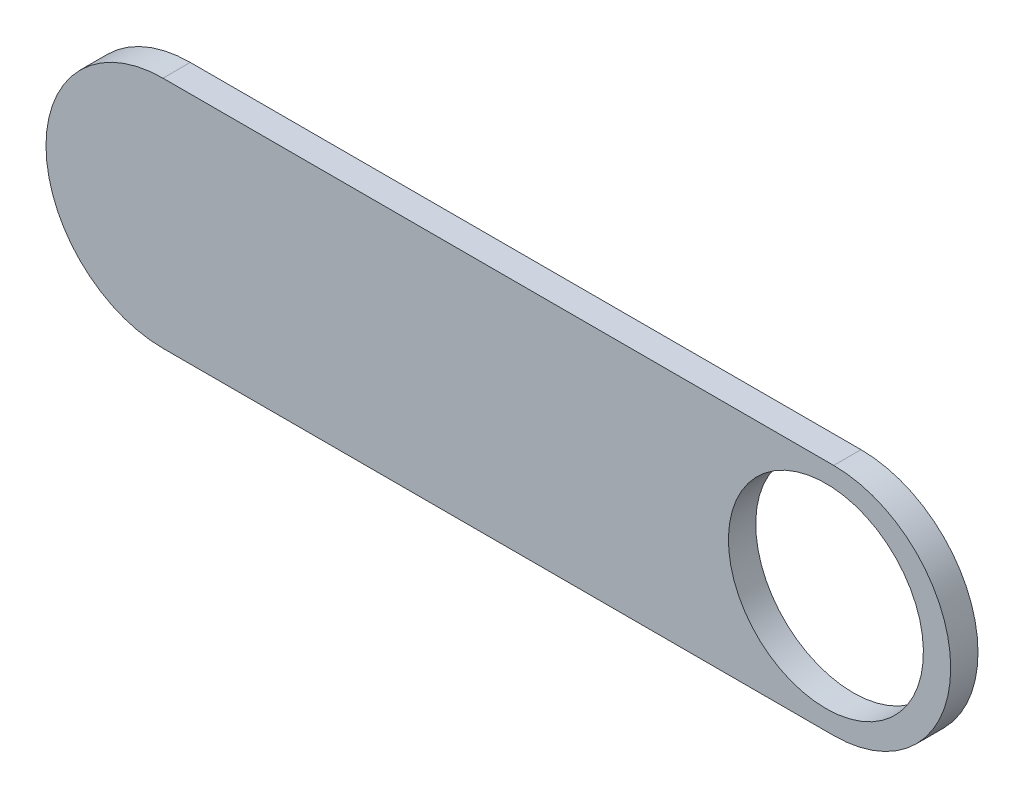
ISO-10303-21;
HEADER;
FILE_DESCRIPTION(('STEP AP214'),'2;1');
FILE_NAME('part.step','',(''),(''),'','','');
FILE_SCHEMA(('AUTOMOTIVE_DESIGN { 1 0 10303 214 1 1 1 1 }'));
ENDSEC;
DATA;
#1=APPLICATION_CONTEXT('core data for automotive mechanical design processes');
#2=APPLICATION_PROTOCOL_DEFINITION('international standard','automotive_design',2000,#1);
#3=PRODUCT_CONTEXT('',#1,'mechanical');
#4=PRODUCT('Part','Part','',(#3));
#5=PRODUCT_RELATED_PRODUCT_CATEGORY('part','',(#4));
#6=PRODUCT_DEFINITION_FORMATION('','',#4);
#7=PRODUCT_DEFINITION_CONTEXT('part definition',#1,'design');
#8=PRODUCT_DEFINITION('design','',#6,#7);
#9=PRODUCT_DEFINITION_SHAPE('','',#8);
#10=(LENGTH_UNIT() NAMED_UNIT(*) SI_UNIT(.MILLI.,.METRE.));
#11=(NAMED_UNIT(*) PLANE_ANGLE_UNIT() SI_UNIT($,.RADIAN.));
#12=(NAMED_UNIT(*) SI_UNIT($,.STERADIAN.) SOLID_ANGLE_UNIT());
#13=UNCERTAINTY_MEASURE_WITH_UNIT(LENGTH_MEASURE(1.E-05),#10,'distance_accuracy_value','');
#14=(GEOMETRIC_REPRESENTATION_CONTEXT(3) GLOBAL_UNCERTAINTY_ASSIGNED_CONTEXT((#13)) GLOBAL_UNIT_ASSIGNED_CONTEXT((#10,
#11,#12)) REPRESENTATION_CONTEXT('',''));
#15=CARTESIAN_POINT('',(0.,0.,0.));
#16=DIRECTION('',(0.,0.,1.));
#17=DIRECTION('',(1.,0.,0.));
#18=AXIS2_PLACEMENT_3D('',#15,#16,#17);
#19=CARTESIAN_POINT('',(141.22,-109.85,-0.045));
#20=DIRECTION('',(0.,0.,-1.));
#21=DIRECTION('',(0.,-1.,0.));
#22=AXIS2_PLACEMENT_3D('',#19,#20,#21);
#23=CYLINDRICAL_SURFACE('',#22,0.125);
#24=CARTESIAN_POINT('',(141.22,-109.85,1.6));
#25=DIRECTION('',(0.,0.,-1.));
#26=DIRECTION('',(0.,-1.,0.));
#27=AXIS2_PLACEMENT_3D('',#24,#25,#26);
#28=CIRCLE('',#27,0.125);
#29=CARTESIAN_POINT('',(141.22,-109.975,1.6));
#30=VERTEX_POINT('',#29);
#31=EDGE_CURVE('E87',#30,#30,#28,.T.);
#32=ORIENTED_EDGE('',*,*,#31,.T.);
#33=DIRECTION('',(0.,0.,1.));
#34=VECTOR('',#33,1.);
#35=CARTESIAN_POINT('',(141.22,-109.975,-0.045));
#36=LINE('',#35,#34);
#37=CARTESIAN_POINT('',(141.22,-109.975,1.635));
#38=VERTEX_POINT('',#37);
#39=EDGE_CURVE('E11',#30,#38,#36,.T.);
#40=ORIENTED_EDGE('',*,*,#39,.T.);
#41=CARTESIAN_POINT('',(141.22,-109.85,1.635));
#42=DIRECTION('',(0.,0.,-1.));
#43=DIRECTION('',(0.,-1.,0.));
#44=AXIS2_PLACEMENT_3D('',#41,#42,#43);
#45=CIRCLE('',#44,0.125);
#46=EDGE_CURVE('E27',#38,#38,#45,.T.);
#47=ORIENTED_EDGE('',*,*,#46,.F.);
#48=ORIENTED_EDGE('',*,*,#39,.F.);
#49=EDGE_LOOP('',(#32,#40,#47,#48));
#50=FACE_BOUND('',#49,.T.);
#51=ADVANCED_FACE('F17',(#50),#23,.F.);
#52=CARTESIAN_POINT('',(141.23,-109.7,1.6));
#53=DIRECTION('',(0.,-1.,0.));
#54=DIRECTION('',(0.,0.,-1.));
#55=AXIS2_PLACEMENT_3D('',#52,#53,#54);
#56=PLANE('',#55);
#57=DIRECTION('',(-1.,0.,0.));
#58=VECTOR('',#57,1.);
#59=CARTESIAN_POINT('',(141.23,-109.7,1.6));
#60=LINE('',#59,#58);
#61=CARTESIAN_POINT('',(141.23,-109.7,1.6));
#62=VERTEX_POINT('',#61);
#63=CARTESIAN_POINT('',(140.37,-109.7,1.6));
#64=VERTEX_POINT('',#63);
#65=EDGE_CURVE('E77',#62,#64,#60,.T.);
#66=ORIENTED_EDGE('',*,*,#65,.T.);
#67=DIRECTION('',(0.,0.,1.));
#68=VECTOR('',#67,1.);
#69=CARTESIAN_POINT('',(140.37,-109.7,1.6));
#70=LINE('',#69,#68);
#71=CARTESIAN_POINT('',(140.37,-109.7,1.635));
#72=VERTEX_POINT('',#71);
#73=EDGE_CURVE('E101',#64,#72,#70,.T.);
#74=ORIENTED_EDGE('',*,*,#73,.T.);
#75=DIRECTION('',(-1.,0.,0.));
#76=VECTOR('',#75,1.);
#77=CARTESIAN_POINT('',(141.23,-109.7,1.635));
#78=LINE('',#77,#76);
#79=CARTESIAN_POINT('',(141.23,-109.7,1.635));
#80=VERTEX_POINT('',#79);
#81=EDGE_CURVE('E20',#80,#72,#78,.T.);
#82=ORIENTED_EDGE('',*,*,#81,.F.);
#83=DIRECTION('',(0.,0.,1.));
#84=VECTOR('',#83,1.);
#85=CARTESIAN_POINT('',(141.23,-109.7,1.6));
#86=LINE('',#85,#84);
#87=EDGE_CURVE('E91',#62,#80,#86,.T.);
#88=ORIENTED_EDGE('',*,*,#87,.F.);
#89=EDGE_LOOP('',(#66,#74,#82,#88));
#90=FACE_BOUND('',#89,.T.);
#91=ADVANCED_FACE('F92',(#90),#56,.F.);
#92=CARTESIAN_POINT('',(140.37,-110.,1.635));
#93=DIRECTION('',(0.,0.,1.));
#94=DIRECTION('',(1.,0.,0.));
#95=AXIS2_PLACEMENT_3D('',#92,#93,#94);
#96=PLANE('',#95);
#97=ORIENTED_EDGE('',*,*,#46,.T.);
#98=EDGE_LOOP('',(#97));
#99=FACE_BOUND('',#98,.T.);
#100=DIRECTION('',(1.,0.,0.));
#101=VECTOR('',#100,1.);
#102=CARTESIAN_POINT('',(140.37,-110.,1.635));
#103=LINE('',#102,#101);
#104=CARTESIAN_POINT('',(140.37,-110.,1.635));
#105=VERTEX_POINT('',#104);
#106=CARTESIAN_POINT('',(141.23,-110.,1.635));
#107=VERTEX_POINT('',#106);
#108=EDGE_CURVE('E132',#105,#107,#103,.T.);
#109=ORIENTED_EDGE('',*,*,#108,.T.);
#110=CARTESIAN_POINT('',(141.23,-109.85,1.635));
#111=DIRECTION('',(0.,0.,1.));
#112=DIRECTION('',(-1.894780628694E-13,-1.,0.));
#113=AXIS2_PLACEMENT_3D('',#110,#111,#112);
#114=CIRCLE('',#113,0.15);
#115=EDGE_CURVE('E88',#107,#80,#114,.T.);
#116=ORIENTED_EDGE('',*,*,#115,.T.);
#117=ORIENTED_EDGE('',*,*,#81,.T.);
#118=CARTESIAN_POINT('',(140.37,-109.85,1.635));
#119=DIRECTION('',(0.,0.,1.));
#120=DIRECTION('',(0.,1.,0.));
#121=AXIS2_PLACEMENT_3D('',#118,#119,#120);
#122=CIRCLE('',#121,0.15);
#123=EDGE_CURVE('E107',#72,#105,#122,.T.);
#124=ORIENTED_EDGE('',*,*,#123,.T.);
#125=EDGE_LOOP('',(#109,#116,#117,#124));
#126=FACE_BOUND('',#125,.T.);
#127=ADVANCED_FACE('F214',(#99,#126),#96,.T.);
#128=CARTESIAN_POINT('',(140.37,-110.,1.6));
#129=DIRECTION('',(0.,0.,1.));
#130=DIRECTION('',(1.,0.,0.));
#131=AXIS2_PLACEMENT_3D('',#128,#129,#130);
#132=PLANE('',#131);
#133=ORIENTED_EDGE('',*,*,#31,.F.);
#134=EDGE_LOOP('',(#133));
#135=FACE_BOUND('',#134,.T.);
#136=CARTESIAN_POINT('',(140.37,-109.85,1.6));
#137=DIRECTION('',(0.,0.,1.));
#138=DIRECTION('',(0.,1.,0.));
#139=AXIS2_PLACEMENT_3D('',#136,#137,#138);
#140=CIRCLE('',#139,0.15);
#141=CARTESIAN_POINT('',(140.37,-110.,1.6));
#142=VERTEX_POINT('',#141);
#143=EDGE_CURVE('E84',#64,#142,#140,.T.);
#144=ORIENTED_EDGE('',*,*,#143,.F.);
#145=ORIENTED_EDGE('',*,*,#65,.F.);
#146=CARTESIAN_POINT('',(141.23,-109.85,1.6));
#147=DIRECTION('',(0.,0.,1.));
#148=DIRECTION('',(-1.894780628694E-13,-1.,0.));
#149=AXIS2_PLACEMENT_3D('',#146,#147,#148);
#150=CIRCLE('',#149,0.15);
#151=CARTESIAN_POINT('',(141.23,-110.,1.6));
#152=VERTEX_POINT('',#151);
#153=EDGE_CURVE('E81',#152,#62,#150,.T.);
#154=ORIENTED_EDGE('',*,*,#153,.F.);
#155=DIRECTION('',(1.,0.,0.));
#156=VECTOR('',#155,1.);
#157=CARTESIAN_POINT('',(140.37,-110.,1.6));
#158=LINE('',#157,#156);
#159=EDGE_CURVE('E150',#142,#152,#158,.T.);
#160=ORIENTED_EDGE('',*,*,#159,.F.);
#161=EDGE_LOOP('',(#144,#145,#154,#160));
#162=FACE_BOUND('',#161,.T.);
#163=ADVANCED_FACE('F78',(#135,#162),#132,.F.);
#164=CARTESIAN_POINT('',(141.23,-109.85,1.6));
#165=DIRECTION('',(0.,0.,-1.));
#166=DIRECTION('',(-1.894780628694E-13,-1.,0.));
#167=AXIS2_PLACEMENT_3D('',#164,#165,#166);
#168=CYLINDRICAL_SURFACE('',#167,0.15);
#169=ORIENTED_EDGE('',*,*,#153,.T.);
#170=ORIENTED_EDGE('',*,*,#87,.T.);
#171=ORIENTED_EDGE('',*,*,#115,.F.);
#172=DIRECTION('',(0.,0.,1.));
#173=VECTOR('',#172,1.);
#174=CARTESIAN_POINT('',(141.23,-110.,1.6));
#175=LINE('',#174,#173);
#176=EDGE_CURVE('E98',#152,#107,#175,.T.);
#177=ORIENTED_EDGE('',*,*,#176,.F.);
#178=EDGE_LOOP('',(#169,#170,#171,#177));
#179=FACE_BOUND('',#178,.T.);
#180=ADVANCED_FACE('F96',(#179),#168,.T.);
#181=CARTESIAN_POINT('',(140.37,-109.85,1.6));
#182=DIRECTION('',(0.,0.,-1.));
#183=DIRECTION('',(0.,1.,0.));
#184=AXIS2_PLACEMENT_3D('',#181,#182,#183);
#185=CYLINDRICAL_SURFACE('',#184,0.15);
#186=ORIENTED_EDGE('',*,*,#143,.T.);
#187=DIRECTION('',(0.,0.,1.));
#188=VECTOR('',#187,1.);
#189=CARTESIAN_POINT('',(140.37,-110.,1.6));
#190=LINE('',#189,#188);
#191=EDGE_CURVE('E135',#142,#105,#190,.T.);
#192=ORIENTED_EDGE('',*,*,#191,.T.);
#193=ORIENTED_EDGE('',*,*,#123,.F.);
#194=ORIENTED_EDGE('',*,*,#73,.F.);
#195=EDGE_LOOP('',(#186,#192,#193,#194));
#196=FACE_BOUND('',#195,.T.);
#197=ADVANCED_FACE('F147',(#196),#185,.T.);
#198=CARTESIAN_POINT('',(140.37,-110.,1.6));
#199=DIRECTION('',(0.,1.,0.));
#200=DIRECTION('',(1.,0.,0.));
#201=AXIS2_PLACEMENT_3D('',#198,#199,#200);
#202=PLANE('',#201);
#203=ORIENTED_EDGE('',*,*,#159,.T.);
#204=ORIENTED_EDGE('',*,*,#176,.T.);
#205=ORIENTED_EDGE('',*,*,#108,.F.);
#206=ORIENTED_EDGE('',*,*,#191,.F.);
#207=EDGE_LOOP('',(#203,#204,#205,#206));
#208=FACE_BOUND('',#207,.T.);
#209=ADVANCED_FACE('F149',(#208),#202,.F.);
#210=CLOSED_SHELL('',(#51,#91,#127,#163,#180,#197,#209));
#211=MANIFOLD_SOLID_BREP('B1',#210);
#212=ADVANCED_BREP_SHAPE_REPRESENTATION('',(#18,#211),#14);
#213=SHAPE_DEFINITION_REPRESENTATION(#9,#212);
ENDSEC;
END-ISO-10303-21;
